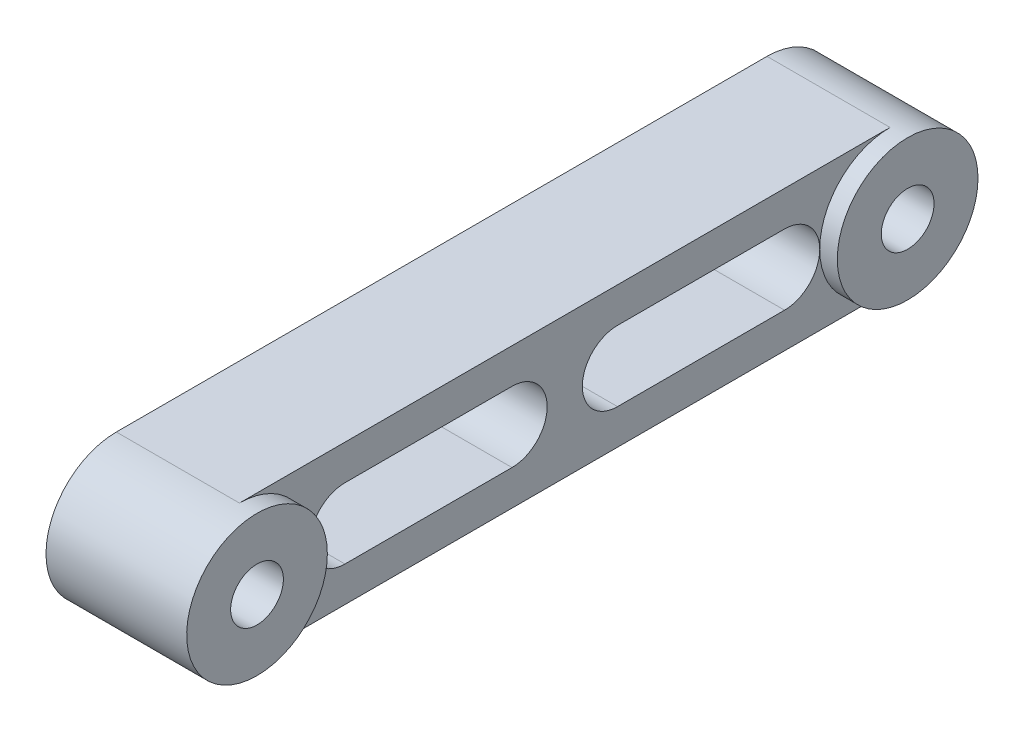
ISO-10303-21;
HEADER;
FILE_DESCRIPTION(('STEP AP214'),'2;1');
FILE_NAME('part.step','',(''),(''),'','','');
FILE_SCHEMA(('AUTOMOTIVE_DESIGN { 1 0 10303 214 1 1 1 1 }'));
ENDSEC;
DATA;
#1=APPLICATION_CONTEXT('core data for automotive mechanical design processes');
#2=APPLICATION_PROTOCOL_DEFINITION('international standard','automotive_design',2000,#1);
#3=PRODUCT_CONTEXT('',#1,'mechanical');
#4=PRODUCT('Part','Part','',(#3));
#5=PRODUCT_RELATED_PRODUCT_CATEGORY('part','',(#4));
#6=PRODUCT_DEFINITION_FORMATION('','',#4);
#7=PRODUCT_DEFINITION_CONTEXT('part definition',#1,'design');
#8=PRODUCT_DEFINITION('design','',#6,#7);
#9=PRODUCT_DEFINITION_SHAPE('','',#8);
#10=(LENGTH_UNIT() NAMED_UNIT(*) SI_UNIT(.MILLI.,.METRE.));
#11=(NAMED_UNIT(*) PLANE_ANGLE_UNIT() SI_UNIT($,.RADIAN.));
#12=(NAMED_UNIT(*) SI_UNIT($,.STERADIAN.) SOLID_ANGLE_UNIT());
#13=UNCERTAINTY_MEASURE_WITH_UNIT(LENGTH_MEASURE(1.E-05),#10,'distance_accuracy_value','');
#14=(GEOMETRIC_REPRESENTATION_CONTEXT(3) GLOBAL_UNCERTAINTY_ASSIGNED_CONTEXT((#13)) GLOBAL_UNIT_ASSIGNED_CONTEXT((#10,
#11,#12)) REPRESENTATION_CONTEXT('',''));
#15=CARTESIAN_POINT('',(0.,0.,0.));
#16=DIRECTION('',(0.,0.,1.));
#17=DIRECTION('',(1.,0.,0.));
#18=AXIS2_PLACEMENT_3D('',#15,#16,#17);
#19=CARTESIAN_POINT('',(7.,0.,0.));
#20=DIRECTION('',(1.,0.,0.));
#21=DIRECTION('',(0.,0.,-1.));
#22=AXIS2_PLACEMENT_3D('',#19,#20,#21);
#23=PLANE('',#22);
#24=CARTESIAN_POINT('',(7.,0.,-6.));
#25=DIRECTION('',(1.,0.,0.));
#26=DIRECTION('',(0.,0.,-1.));
#27=AXIS2_PLACEMENT_3D('',#24,#25,#26);
#28=CIRCLE('',#27,2.);
#29=CARTESIAN_POINT('',(7.,0.,-4.));
#30=VERTEX_POINT('',#29);
#31=CARTESIAN_POINT('',(7.,-2.,-6.));
#32=VERTEX_POINT('',#31);
#33=EDGE_CURVE('E155',#30,#32,#28,.T.);
#34=ORIENTED_EDGE('',*,*,#33,.F.);
#35=CARTESIAN_POINT('',(7.,0.,0.));
#36=DIRECTION('',(1.,0.,0.));
#37=DIRECTION('',(0.,0.,-1.));
#38=AXIS2_PLACEMENT_3D('',#35,#36,#37);
#39=CIRCLE('',#38,4.);
#40=CARTESIAN_POINT('',(7.,-4.,0.));
#41=VERTEX_POINT('',#40);
#42=EDGE_CURVE('E141',#41,#30,#39,.T.);
#43=ORIENTED_EDGE('',*,*,#42,.F.);
#44=DIRECTION('',(0.,0.,-1.));
#45=VECTOR('',#44,1.);
#46=CARTESIAN_POINT('',(7.,-4.,0.));
#47=LINE('',#46,#45);
#48=CARTESIAN_POINT('',(7.,-4.,-37.));
#49=VERTEX_POINT('',#48);
#50=EDGE_CURVE('E148',#41,#49,#47,.T.);
#51=ORIENTED_EDGE('',*,*,#50,.T.);
#52=CARTESIAN_POINT('',(7.,0.,-37.));
#53=DIRECTION('',(1.,0.,0.));
#54=DIRECTION('',(0.,0.,-1.));
#55=AXIS2_PLACEMENT_3D('',#52,#53,#54);
#56=CIRCLE('',#55,4.);
#57=CARTESIAN_POINT('',(7.,0.,-33.));
#58=VERTEX_POINT('',#57);
#59=EDGE_CURVE('E11',#58,#49,#56,.T.);
#60=ORIENTED_EDGE('',*,*,#59,.F.);
#61=CARTESIAN_POINT('',(7.,0.,-31.));
#62=DIRECTION('',(1.,0.,0.));
#63=DIRECTION('',(0.,0.,1.));
#64=AXIS2_PLACEMENT_3D('',#61,#62,#63);
#65=CIRCLE('',#64,2.);
#66=CARTESIAN_POINT('',(7.,-2.,-31.));
#67=VERTEX_POINT('',#66);
#68=EDGE_CURVE('E224',#67,#58,#65,.T.);
#69=ORIENTED_EDGE('',*,*,#68,.F.);
#70=DIRECTION('',(0.,0.,-1.));
#71=VECTOR('',#70,1.);
#72=CARTESIAN_POINT('',(7.,-2.,-21.5));
#73=LINE('',#72,#71);
#74=CARTESIAN_POINT('',(7.,-2.,-21.5));
#75=VERTEX_POINT('',#74);
#76=EDGE_CURVE('E220',#75,#67,#73,.T.);
#77=ORIENTED_EDGE('',*,*,#76,.F.);
#78=CARTESIAN_POINT('',(7.,0.,-21.5));
#79=DIRECTION('',(1.,0.,0.));
#80=DIRECTION('',(0.,0.,1.));
#81=AXIS2_PLACEMENT_3D('',#78,#79,#80);
#82=CIRCLE('',#81,2.);
#83=CARTESIAN_POINT('',(7.,2.,-21.5));
#84=VERTEX_POINT('',#83);
#85=EDGE_CURVE('E168',#84,#75,#82,.T.);
#86=ORIENTED_EDGE('',*,*,#85,.F.);
#87=DIRECTION('',(0.,0.,1.));
#88=VECTOR('',#87,1.);
#89=CARTESIAN_POINT('',(7.,2.,-21.5));
#90=LINE('',#89,#88);
#91=CARTESIAN_POINT('',(7.,2.,-31.));
#92=VERTEX_POINT('',#91);
#93=EDGE_CURVE('E209',#92,#84,#90,.T.);
#94=ORIENTED_EDGE('',*,*,#93,.F.);
#95=EDGE_CURVE('E223',#58,#92,#65,.T.);
#96=ORIENTED_EDGE('',*,*,#95,.F.);
#97=CARTESIAN_POINT('',(7.,4.,-37.));
#98=VERTEX_POINT('',#97);
#99=EDGE_CURVE('E51',#98,#58,#56,.T.);
#100=ORIENTED_EDGE('',*,*,#99,.F.);
#101=DIRECTION('',(0.,0.,1.));
#102=VECTOR('',#101,1.);
#103=CARTESIAN_POINT('',(7.,4.,0.));
#104=LINE('',#103,#102);
#105=CARTESIAN_POINT('',(7.,4.,0.));
#106=VERTEX_POINT('',#105);
#107=EDGE_CURVE('E151',#98,#106,#104,.T.);
#108=ORIENTED_EDGE('',*,*,#107,.T.);
#109=EDGE_CURVE('E58',#30,#106,#39,.T.);
#110=ORIENTED_EDGE('',*,*,#109,.F.);
#111=CARTESIAN_POINT('',(7.,2.,-6.));
#112=VERTEX_POINT('',#111);
#113=EDGE_CURVE('E191',#112,#30,#28,.T.);
#114=ORIENTED_EDGE('',*,*,#113,.F.);
#115=DIRECTION('',(0.,0.,1.));
#116=VECTOR('',#115,1.);
#117=CARTESIAN_POINT('',(7.,2.,-15.5));
#118=LINE('',#117,#116);
#119=CARTESIAN_POINT('',(7.,2.,-15.5));
#120=VERTEX_POINT('',#119);
#121=EDGE_CURVE('E187',#120,#112,#118,.T.);
#122=ORIENTED_EDGE('',*,*,#121,.F.);
#123=CARTESIAN_POINT('',(7.,0.,-15.5));
#124=DIRECTION('',(1.,0.,0.));
#125=DIRECTION('',(0.,0.,-1.));
#126=AXIS2_PLACEMENT_3D('',#123,#124,#125);
#127=CIRCLE('',#126,2.);
#128=CARTESIAN_POINT('',(7.,-2.,-15.5));
#129=VERTEX_POINT('',#128);
#130=EDGE_CURVE('E185',#129,#120,#127,.T.);
#131=ORIENTED_EDGE('',*,*,#130,.F.);
#132=DIRECTION('',(0.,0.,-1.));
#133=VECTOR('',#132,1.);
#134=CARTESIAN_POINT('',(7.,-2.,-15.5));
#135=LINE('',#134,#133);
#136=EDGE_CURVE('E175',#32,#129,#135,.T.);
#137=ORIENTED_EDGE('',*,*,#136,.F.);
#138=EDGE_LOOP('',(#34,#43,#51,#60,#69,#77,#86,#94,#96,#100,#108,#110,#114,#122,#131,#137));
#139=FACE_BOUND('',#138,.T.);
#140=ADVANCED_FACE('F41',(#139),#23,.T.);
#141=CARTESIAN_POINT('',(0.,0.,0.));
#142=DIRECTION('',(1.,0.,0.));
#143=DIRECTION('',(0.,0.,-1.));
#144=AXIS2_PLACEMENT_3D('',#141,#142,#143);
#145=PLANE('',#144);
#146=CARTESIAN_POINT('',(0.,0.,0.));
#147=DIRECTION('',(1.,0.,0.));
#148=DIRECTION('',(0.,0.,-1.));
#149=AXIS2_PLACEMENT_3D('',#146,#147,#148);
#150=CIRCLE('',#149,4.);
#151=CARTESIAN_POINT('',(0.,4.,0.));
#152=VERTEX_POINT('',#151);
#153=CARTESIAN_POINT('',(0.,-4.,0.));
#154=VERTEX_POINT('',#153);
#155=EDGE_CURVE('E144',#152,#154,#150,.T.);
#156=ORIENTED_EDGE('',*,*,#155,.F.);
#157=DIRECTION('',(0.,0.,1.));
#158=VECTOR('',#157,1.);
#159=CARTESIAN_POINT('',(0.,4.,0.));
#160=LINE('',#159,#158);
#161=CARTESIAN_POINT('',(0.,4.,-37.));
#162=VERTEX_POINT('',#161);
#163=EDGE_CURVE('E152',#162,#152,#160,.T.);
#164=ORIENTED_EDGE('',*,*,#163,.F.);
#165=CARTESIAN_POINT('',(0.,0.,-37.));
#166=DIRECTION('',(1.,0.,0.));
#167=DIRECTION('',(0.,0.,-1.));
#168=AXIS2_PLACEMENT_3D('',#165,#166,#167);
#169=CIRCLE('',#168,4.);
#170=CARTESIAN_POINT('',(0.,-4.,-37.));
#171=VERTEX_POINT('',#170);
#172=EDGE_CURVE('E247',#171,#162,#169,.T.);
#173=ORIENTED_EDGE('',*,*,#172,.F.);
#174=DIRECTION('',(0.,0.,-1.));
#175=VECTOR('',#174,1.);
#176=CARTESIAN_POINT('',(0.,-4.,0.));
#177=LINE('',#176,#175);
#178=EDGE_CURVE('E245',#154,#171,#177,.T.);
#179=ORIENTED_EDGE('',*,*,#178,.F.);
#180=EDGE_LOOP('',(#156,#164,#173,#179));
#181=FACE_BOUND('',#180,.T.);
#182=CARTESIAN_POINT('',(0.,0.,0.));
#183=DIRECTION('',(1.,0.,0.));
#184=DIRECTION('',(0.,0.,-1.));
#185=AXIS2_PLACEMENT_3D('',#182,#183,#184);
#186=CIRCLE('',#185,1.5);
#187=CARTESIAN_POINT('',(0.,0.,-1.5));
#188=VERTEX_POINT('',#187);
#189=EDGE_CURVE('E239',#188,#188,#186,.T.);
#190=ORIENTED_EDGE('',*,*,#189,.T.);
#191=EDGE_LOOP('',(#190));
#192=FACE_BOUND('',#191,.T.);
#193=CARTESIAN_POINT('',(0.,0.,-37.));
#194=DIRECTION('',(1.,0.,0.));
#195=DIRECTION('',(0.,0.,-1.));
#196=AXIS2_PLACEMENT_3D('',#193,#194,#195);
#197=CIRCLE('',#196,1.5);
#198=CARTESIAN_POINT('',(0.,0.,-38.5));
#199=VERTEX_POINT('',#198);
#200=EDGE_CURVE('E197',#199,#199,#197,.T.);
#201=ORIENTED_EDGE('',*,*,#200,.T.);
#202=EDGE_LOOP('',(#201));
#203=FACE_BOUND('',#202,.T.);
#204=ADVANCED_FACE('F260',(#181,#192,#203),#145,.F.);
#205=CARTESIAN_POINT('',(7.,0.,0.));
#206=DIRECTION('',(-1.,0.,0.));
#207=DIRECTION('',(0.,0.,1.));
#208=AXIS2_PLACEMENT_3D('',#205,#206,#207);
#209=CYLINDRICAL_SURFACE('',#208,4.);
#210=ORIENTED_EDGE('',*,*,#155,.T.);
#211=DIRECTION('',(-1.,0.,0.));
#212=VECTOR('',#211,1.);
#213=CARTESIAN_POINT('',(7.,-4.,0.));
#214=LINE('',#213,#212);
#215=EDGE_CURVE('E45',#41,#154,#214,.T.);
#216=ORIENTED_EDGE('',*,*,#215,.F.);
#217=ORIENTED_EDGE('',*,*,#42,.T.);
#218=ORIENTED_EDGE('',*,*,#109,.T.);
#219=DIRECTION('',(-1.,0.,0.));
#220=VECTOR('',#219,1.);
#221=CARTESIAN_POINT('',(7.,4.,0.));
#222=LINE('',#221,#220);
#223=EDGE_CURVE('E243',#106,#152,#222,.T.);
#224=ORIENTED_EDGE('',*,*,#223,.T.);
#225=EDGE_LOOP('',(#210,#216,#217,#218,#224));
#226=FACE_BOUND('',#225,.T.);
#227=CARTESIAN_POINT('',(8.,0.,0.));
#228=DIRECTION('',(1.,0.,0.));
#229=DIRECTION('',(0.,0.,-1.));
#230=AXIS2_PLACEMENT_3D('',#227,#228,#229);
#231=CIRCLE('',#230,4.);
#232=CARTESIAN_POINT('',(8.,0.,-4.));
#233=VERTEX_POINT('',#232);
#234=EDGE_CURVE('E161',#233,#233,#231,.T.);
#235=ORIENTED_EDGE('',*,*,#234,.F.);
#236=EDGE_LOOP('',(#235));
#237=FACE_BOUND('',#236,.T.);
#238=ADVANCED_FACE('F43',(#226,#237),#209,.T.);
#239=CARTESIAN_POINT('',(7.,-4.,0.));
#240=DIRECTION('',(0.,1.,0.));
#241=DIRECTION('',(0.,0.,1.));
#242=AXIS2_PLACEMENT_3D('',#239,#240,#241);
#243=PLANE('',#242);
#244=ORIENTED_EDGE('',*,*,#178,.T.);
#245=DIRECTION('',(-1.,0.,0.));
#246=VECTOR('',#245,1.);
#247=CARTESIAN_POINT('',(7.,-4.,-37.));
#248=LINE('',#247,#246);
#249=EDGE_CURVE('E146',#49,#171,#248,.T.);
#250=ORIENTED_EDGE('',*,*,#249,.F.);
#251=ORIENTED_EDGE('',*,*,#50,.F.);
#252=ORIENTED_EDGE('',*,*,#215,.T.);
#253=EDGE_LOOP('',(#244,#250,#251,#252));
#254=FACE_BOUND('',#253,.T.);
#255=ADVANCED_FACE('F149',(#254),#243,.F.);
#256=CARTESIAN_POINT('',(7.,0.,-37.));
#257=DIRECTION('',(-1.,0.,0.));
#258=DIRECTION('',(0.,0.,1.));
#259=AXIS2_PLACEMENT_3D('',#256,#257,#258);
#260=CYLINDRICAL_SURFACE('',#259,4.);
#261=ORIENTED_EDGE('',*,*,#172,.T.);
#262=DIRECTION('',(-1.,0.,0.));
#263=VECTOR('',#262,1.);
#264=CARTESIAN_POINT('',(7.,4.,-37.));
#265=LINE('',#264,#263);
#266=EDGE_CURVE('E251',#98,#162,#265,.T.);
#267=ORIENTED_EDGE('',*,*,#266,.F.);
#268=ORIENTED_EDGE('',*,*,#99,.T.);
#269=ORIENTED_EDGE('',*,*,#59,.T.);
#270=ORIENTED_EDGE('',*,*,#249,.T.);
#271=EDGE_LOOP('',(#261,#267,#268,#269,#270));
#272=FACE_BOUND('',#271,.T.);
#273=CARTESIAN_POINT('',(8.,0.,-37.));
#274=DIRECTION('',(1.,0.,0.));
#275=DIRECTION('',(0.,0.,-1.));
#276=AXIS2_PLACEMENT_3D('',#273,#274,#275);
#277=CIRCLE('',#276,4.);
#278=CARTESIAN_POINT('',(8.,0.,-41.));
#279=VERTEX_POINT('',#278);
#280=EDGE_CURVE('E166',#279,#279,#277,.T.);
#281=ORIENTED_EDGE('',*,*,#280,.F.);
#282=EDGE_LOOP('',(#281));
#283=FACE_BOUND('',#282,.T.);
#284=ADVANCED_FACE('F255',(#272,#283),#260,.T.);
#285=CARTESIAN_POINT('',(7.,4.,0.));
#286=DIRECTION('',(0.,-1.,0.));
#287=DIRECTION('',(0.,0.,-1.));
#288=AXIS2_PLACEMENT_3D('',#285,#286,#287);
#289=PLANE('',#288);
#290=ORIENTED_EDGE('',*,*,#163,.T.);
#291=ORIENTED_EDGE('',*,*,#223,.F.);
#292=ORIENTED_EDGE('',*,*,#107,.F.);
#293=ORIENTED_EDGE('',*,*,#266,.T.);
#294=EDGE_LOOP('',(#290,#291,#292,#293));
#295=FACE_BOUND('',#294,.T.);
#296=ADVANCED_FACE('F264',(#295),#289,.F.);
#297=CARTESIAN_POINT('',(7.,0.,0.));
#298=DIRECTION('',(-1.,0.,0.));
#299=DIRECTION('',(0.,0.,1.));
#300=AXIS2_PLACEMENT_3D('',#297,#298,#299);
#301=CYLINDRICAL_SURFACE('',#300,1.5);
#302=ORIENTED_EDGE('',*,*,#189,.F.);
#303=EDGE_LOOP('',(#302));
#304=FACE_BOUND('',#303,.T.);
#305=CARTESIAN_POINT('',(8.,0.,0.));
#306=DIRECTION('',(1.,0.,0.));
#307=DIRECTION('',(0.,0.,-1.));
#308=AXIS2_PLACEMENT_3D('',#305,#306,#307);
#309=CIRCLE('',#308,1.5);
#310=CARTESIAN_POINT('',(8.,0.,-1.5));
#311=VERTEX_POINT('',#310);
#312=EDGE_CURVE('E158',#311,#311,#309,.F.);
#313=ORIENTED_EDGE('',*,*,#312,.F.);
#314=EDGE_LOOP('',(#313));
#315=FACE_BOUND('',#314,.T.);
#316=ADVANCED_FACE('F304',(#304,#315),#301,.F.);
#317=CARTESIAN_POINT('',(7.,0.,-37.));
#318=DIRECTION('',(-1.,0.,0.));
#319=DIRECTION('',(0.,0.,1.));
#320=AXIS2_PLACEMENT_3D('',#317,#318,#319);
#321=CYLINDRICAL_SURFACE('',#320,1.5);
#322=ORIENTED_EDGE('',*,*,#200,.F.);
#323=EDGE_LOOP('',(#322));
#324=FACE_BOUND('',#323,.T.);
#325=CARTESIAN_POINT('',(8.,0.,-37.));
#326=DIRECTION('',(1.,0.,0.));
#327=DIRECTION('',(0.,0.,-1.));
#328=AXIS2_PLACEMENT_3D('',#325,#326,#327);
#329=CIRCLE('',#328,1.5);
#330=CARTESIAN_POINT('',(8.,0.,-38.5));
#331=VERTEX_POINT('',#330);
#332=EDGE_CURVE('E163',#331,#331,#329,.F.);
#333=ORIENTED_EDGE('',*,*,#332,.F.);
#334=EDGE_LOOP('',(#333));
#335=FACE_BOUND('',#334,.T.);
#336=ADVANCED_FACE('F342',(#324,#335),#321,.F.);
#337=CARTESIAN_POINT('',(2.,0.,-21.5));
#338=DIRECTION('',(1.,0.,0.));
#339=DIRECTION('',(0.,0.,-1.));
#340=AXIS2_PLACEMENT_3D('',#337,#338,#339);
#341=CYLINDRICAL_SURFACE('',#340,2.);
#342=ORIENTED_EDGE('',*,*,#85,.T.);
#343=DIRECTION('',(1.,0.,0.));
#344=VECTOR('',#343,1.);
#345=CARTESIAN_POINT('',(2.,-2.,-21.5));
#346=LINE('',#345,#344);
#347=CARTESIAN_POINT('',(2.,-2.,-21.5));
#348=VERTEX_POINT('',#347);
#349=EDGE_CURVE('E218',#348,#75,#346,.T.);
#350=ORIENTED_EDGE('',*,*,#349,.F.);
#351=CARTESIAN_POINT('',(2.,0.,-21.5));
#352=DIRECTION('',(1.,0.,0.));
#353=DIRECTION('',(0.,0.,1.));
#354=AXIS2_PLACEMENT_3D('',#351,#352,#353);
#355=CIRCLE('',#354,2.);
#356=CARTESIAN_POINT('',(2.,2.,-21.5));
#357=VERTEX_POINT('',#356);
#358=EDGE_CURVE('E205',#357,#348,#355,.T.);
#359=ORIENTED_EDGE('',*,*,#358,.F.);
#360=DIRECTION('',(1.,0.,0.));
#361=VECTOR('',#360,1.);
#362=CARTESIAN_POINT('',(2.,2.,-21.5));
#363=LINE('',#362,#361);
#364=EDGE_CURVE('E188',#357,#84,#363,.T.);
#365=ORIENTED_EDGE('',*,*,#364,.T.);
#366=EDGE_LOOP('',(#342,#350,#359,#365));
#367=FACE_BOUND('',#366,.T.);
#368=ADVANCED_FACE('F277',(#367),#341,.F.);
#369=CARTESIAN_POINT('',(2.,2.,-21.5));
#370=DIRECTION('',(0.,1.,0.));
#371=DIRECTION('',(0.,0.,1.));
#372=AXIS2_PLACEMENT_3D('',#369,#370,#371);
#373=PLANE('',#372);
#374=ORIENTED_EDGE('',*,*,#93,.T.);
#375=ORIENTED_EDGE('',*,*,#364,.F.);
#376=DIRECTION('',(0.,0.,1.));
#377=VECTOR('',#376,1.);
#378=CARTESIAN_POINT('',(2.,2.,-21.5));
#379=LINE('',#378,#377);
#380=CARTESIAN_POINT('',(2.,2.,-31.));
#381=VERTEX_POINT('',#380);
#382=EDGE_CURVE('E215',#381,#357,#379,.T.);
#383=ORIENTED_EDGE('',*,*,#382,.F.);
#384=DIRECTION('',(1.,0.,0.));
#385=VECTOR('',#384,1.);
#386=CARTESIAN_POINT('',(2.,2.,-31.));
#387=LINE('',#386,#385);
#388=EDGE_CURVE('E230',#381,#92,#387,.T.);
#389=ORIENTED_EDGE('',*,*,#388,.T.);
#390=EDGE_LOOP('',(#374,#375,#383,#389));
#391=FACE_BOUND('',#390,.T.);
#392=ADVANCED_FACE('F280',(#391),#373,.F.);
#393=CARTESIAN_POINT('',(2.,0.,-31.));
#394=DIRECTION('',(1.,0.,0.));
#395=DIRECTION('',(0.,0.,-1.));
#396=AXIS2_PLACEMENT_3D('',#393,#394,#395);
#397=CYLINDRICAL_SURFACE('',#396,2.);
#398=ORIENTED_EDGE('',*,*,#68,.T.);
#399=ORIENTED_EDGE('',*,*,#95,.T.);
#400=ORIENTED_EDGE('',*,*,#388,.F.);
#401=CARTESIAN_POINT('',(2.,0.,-31.));
#402=DIRECTION('',(1.,0.,0.));
#403=DIRECTION('',(0.,0.,1.));
#404=AXIS2_PLACEMENT_3D('',#401,#402,#403);
#405=CIRCLE('',#404,2.);
#406=CARTESIAN_POINT('',(2.,-2.,-31.));
#407=VERTEX_POINT('',#406);
#408=EDGE_CURVE('E212',#407,#381,#405,.T.);
#409=ORIENTED_EDGE('',*,*,#408,.F.);
#410=DIRECTION('',(1.,0.,0.));
#411=VECTOR('',#410,1.);
#412=CARTESIAN_POINT('',(2.,-2.,-31.));
#413=LINE('',#412,#411);
#414=EDGE_CURVE('E233',#407,#67,#413,.T.);
#415=ORIENTED_EDGE('',*,*,#414,.T.);
#416=EDGE_LOOP('',(#398,#399,#400,#409,#415));
#417=FACE_BOUND('',#416,.T.);
#418=ADVANCED_FACE('F269',(#417),#397,.F.);
#419=CARTESIAN_POINT('',(2.,-2.,-21.5));
#420=DIRECTION('',(0.,-1.,0.));
#421=DIRECTION('',(0.,0.,-1.));
#422=AXIS2_PLACEMENT_3D('',#419,#420,#421);
#423=PLANE('',#422);
#424=ORIENTED_EDGE('',*,*,#76,.T.);
#425=ORIENTED_EDGE('',*,*,#414,.F.);
#426=DIRECTION('',(0.,0.,-1.));
#427=VECTOR('',#426,1.);
#428=CARTESIAN_POINT('',(2.,-2.,-21.5));
#429=LINE('',#428,#427);
#430=EDGE_CURVE('E208',#348,#407,#429,.T.);
#431=ORIENTED_EDGE('',*,*,#430,.F.);
#432=ORIENTED_EDGE('',*,*,#349,.T.);
#433=EDGE_LOOP('',(#424,#425,#431,#432));
#434=FACE_BOUND('',#433,.T.);
#435=ADVANCED_FACE('F273',(#434),#423,.F.);
#436=CARTESIAN_POINT('',(2.,0.,-21.5));
#437=DIRECTION('',(-1.,0.,0.));
#438=DIRECTION('',(0.,0.,1.));
#439=AXIS2_PLACEMENT_3D('',#436,#437,#438);
#440=PLANE('',#439);
#441=ORIENTED_EDGE('',*,*,#358,.T.);
#442=ORIENTED_EDGE('',*,*,#430,.T.);
#443=ORIENTED_EDGE('',*,*,#408,.T.);
#444=ORIENTED_EDGE('',*,*,#382,.T.);
#445=EDGE_LOOP('',(#441,#442,#443,#444));
#446=FACE_BOUND('',#445,.T.);
#447=ADVANCED_FACE('F282',(#446),#440,.F.);
#448=CARTESIAN_POINT('',(2.,0.,-15.5));
#449=DIRECTION('',(1.,0.,0.));
#450=DIRECTION('',(0.,0.,-1.));
#451=AXIS2_PLACEMENT_3D('',#448,#449,#450);
#452=CYLINDRICAL_SURFACE('',#451,2.);
#453=ORIENTED_EDGE('',*,*,#130,.T.);
#454=DIRECTION('',(1.,0.,0.));
#455=VECTOR('',#454,1.);
#456=CARTESIAN_POINT('',(2.,2.,-15.5));
#457=LINE('',#456,#455);
#458=CARTESIAN_POINT('',(2.,2.,-15.5));
#459=VERTEX_POINT('',#458);
#460=EDGE_CURVE('E184',#459,#120,#457,.T.);
#461=ORIENTED_EDGE('',*,*,#460,.F.);
#462=CARTESIAN_POINT('',(2.,0.,-15.5));
#463=DIRECTION('',(1.,0.,0.));
#464=DIRECTION('',(0.,0.,-1.));
#465=AXIS2_PLACEMENT_3D('',#462,#463,#464);
#466=CIRCLE('',#465,2.);
#467=CARTESIAN_POINT('',(2.,-2.,-15.5));
#468=VERTEX_POINT('',#467);
#469=EDGE_CURVE('E171',#468,#459,#466,.T.);
#470=ORIENTED_EDGE('',*,*,#469,.F.);
#471=DIRECTION('',(1.,0.,0.));
#472=VECTOR('',#471,1.);
#473=CARTESIAN_POINT('',(2.,-2.,-15.5));
#474=LINE('',#473,#472);
#475=EDGE_CURVE('E195',#468,#129,#474,.T.);
#476=ORIENTED_EDGE('',*,*,#475,.T.);
#477=EDGE_LOOP('',(#453,#461,#470,#476));
#478=FACE_BOUND('',#477,.T.);
#479=ADVANCED_FACE('F284',(#478),#452,.F.);
#480=CARTESIAN_POINT('',(2.,-2.,-15.5));
#481=DIRECTION('',(0.,-1.,0.));
#482=DIRECTION('',(0.,0.,-1.));
#483=AXIS2_PLACEMENT_3D('',#480,#481,#482);
#484=PLANE('',#483);
#485=ORIENTED_EDGE('',*,*,#136,.T.);
#486=ORIENTED_EDGE('',*,*,#475,.F.);
#487=DIRECTION('',(0.,0.,-1.));
#488=VECTOR('',#487,1.);
#489=CARTESIAN_POINT('',(2.,-2.,-15.5));
#490=LINE('',#489,#488);
#491=CARTESIAN_POINT('',(2.,-2.,-6.));
#492=VERTEX_POINT('',#491);
#493=EDGE_CURVE('E181',#492,#468,#490,.T.);
#494=ORIENTED_EDGE('',*,*,#493,.F.);
#495=DIRECTION('',(1.,0.,0.));
#496=VECTOR('',#495,1.);
#497=CARTESIAN_POINT('',(2.,-2.,-6.));
#498=LINE('',#497,#496);
#499=EDGE_CURVE('E198',#492,#32,#498,.T.);
#500=ORIENTED_EDGE('',*,*,#499,.T.);
#501=EDGE_LOOP('',(#485,#486,#494,#500));
#502=FACE_BOUND('',#501,.T.);
#503=ADVANCED_FACE('F290',(#502),#484,.F.);
#504=CARTESIAN_POINT('',(2.,0.,-6.));
#505=DIRECTION('',(1.,0.,0.));
#506=DIRECTION('',(0.,0.,-1.));
#507=AXIS2_PLACEMENT_3D('',#504,#505,#506);
#508=CYLINDRICAL_SURFACE('',#507,2.);
#509=ORIENTED_EDGE('',*,*,#113,.T.);
#510=ORIENTED_EDGE('',*,*,#33,.T.);
#511=ORIENTED_EDGE('',*,*,#499,.F.);
#512=CARTESIAN_POINT('',(2.,0.,-6.));
#513=DIRECTION('',(1.,0.,0.));
#514=DIRECTION('',(0.,0.,-1.));
#515=AXIS2_PLACEMENT_3D('',#512,#513,#514);
#516=CIRCLE('',#515,2.);
#517=CARTESIAN_POINT('',(2.,2.,-6.));
#518=VERTEX_POINT('',#517);
#519=EDGE_CURVE('E178',#518,#492,#516,.T.);
#520=ORIENTED_EDGE('',*,*,#519,.F.);
#521=DIRECTION('',(1.,0.,0.));
#522=VECTOR('',#521,1.);
#523=CARTESIAN_POINT('',(2.,2.,-6.));
#524=LINE('',#523,#522);
#525=EDGE_CURVE('E201',#518,#112,#524,.T.);
#526=ORIENTED_EDGE('',*,*,#525,.T.);
#527=EDGE_LOOP('',(#509,#510,#511,#520,#526));
#528=FACE_BOUND('',#527,.T.);
#529=ADVANCED_FACE('F389',(#528),#508,.F.);
#530=CARTESIAN_POINT('',(2.,2.,-15.5));
#531=DIRECTION('',(0.,1.,0.));
#532=DIRECTION('',(0.,0.,1.));
#533=AXIS2_PLACEMENT_3D('',#530,#531,#532);
#534=PLANE('',#533);
#535=ORIENTED_EDGE('',*,*,#121,.T.);
#536=ORIENTED_EDGE('',*,*,#525,.F.);
#537=DIRECTION('',(0.,0.,1.));
#538=VECTOR('',#537,1.);
#539=CARTESIAN_POINT('',(2.,2.,-15.5));
#540=LINE('',#539,#538);
#541=EDGE_CURVE('E174',#459,#518,#540,.T.);
#542=ORIENTED_EDGE('',*,*,#541,.F.);
#543=ORIENTED_EDGE('',*,*,#460,.T.);
#544=EDGE_LOOP('',(#535,#536,#542,#543));
#545=FACE_BOUND('',#544,.T.);
#546=ADVANCED_FACE('F385',(#545),#534,.F.);
#547=CARTESIAN_POINT('',(2.,0.,-15.5));
#548=DIRECTION('',(1.,0.,0.));
#549=DIRECTION('',(0.,0.,-1.));
#550=AXIS2_PLACEMENT_3D('',#547,#548,#549);
#551=PLANE('',#550);
#552=ORIENTED_EDGE('',*,*,#469,.T.);
#553=ORIENTED_EDGE('',*,*,#541,.T.);
#554=ORIENTED_EDGE('',*,*,#519,.T.);
#555=ORIENTED_EDGE('',*,*,#493,.T.);
#556=EDGE_LOOP('',(#552,#553,#554,#555));
#557=FACE_BOUND('',#556,.T.);
#558=ADVANCED_FACE('F370',(#557),#551,.T.);
#559=CARTESIAN_POINT('',(8.,0.,0.));
#560=DIRECTION('',(1.,0.,0.));
#561=DIRECTION('',(0.,0.,-1.));
#562=AXIS2_PLACEMENT_3D('',#559,#560,#561);
#563=PLANE('',#562);
#564=ORIENTED_EDGE('',*,*,#332,.T.);
#565=EDGE_LOOP('',(#564));
#566=FACE_BOUND('',#565,.T.);
#567=ORIENTED_EDGE('',*,*,#280,.T.);
#568=EDGE_LOOP('',(#567));
#569=FACE_BOUND('',#568,.T.);
#570=ADVANCED_FACE('F364',(#566,#569),#563,.T.);
#571=CARTESIAN_POINT('',(8.,0.,0.));
#572=DIRECTION('',(1.,0.,0.));
#573=DIRECTION('',(0.,0.,-1.));
#574=AXIS2_PLACEMENT_3D('',#571,#572,#573);
#575=PLANE('',#574);
#576=ORIENTED_EDGE('',*,*,#312,.T.);
#577=EDGE_LOOP('',(#576));
#578=FACE_BOUND('',#577,.T.);
#579=ORIENTED_EDGE('',*,*,#234,.T.);
#580=EDGE_LOOP('',(#579));
#581=FACE_BOUND('',#580,.T.);
#582=ADVANCED_FACE('F369',(#578,#581),#575,.T.);
#583=CLOSED_SHELL('',(#140,#204,#238,#255,#284,#296,#316,#336,#368,#392,#418,#435,#447,#479,
#503,#529,#546,#558,#570,#582));
#584=MANIFOLD_SOLID_BREP('B2',#583);
#585=ADVANCED_BREP_SHAPE_REPRESENTATION('',(#18,#584),#14);
#586=SHAPE_DEFINITION_REPRESENTATION(#9,#585);
ENDSEC;
END-ISO-10303-21;
